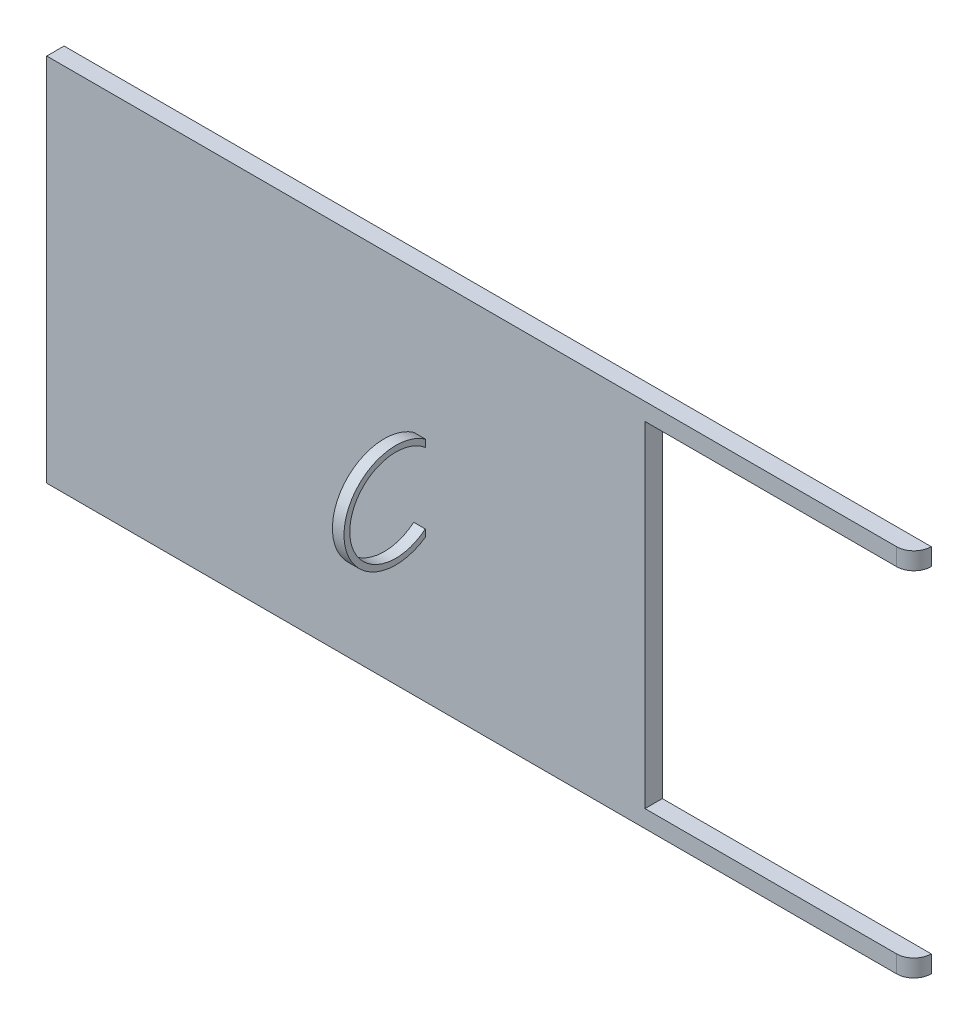
ISO-10303-21;
HEADER;
FILE_DESCRIPTION(('STEP AP214'),'2;1');
FILE_NAME('part.step','',(''),(''),'','','');
FILE_SCHEMA(('AUTOMOTIVE_DESIGN { 1 0 10303 214 1 1 1 1 }'));
ENDSEC;
DATA;
#1=APPLICATION_CONTEXT('core data for automotive mechanical design processes');
#2=APPLICATION_PROTOCOL_DEFINITION('international standard','automotive_design',2000,#1);
#3=PRODUCT_CONTEXT('',#1,'mechanical');
#4=PRODUCT('Part','Part','',(#3));
#5=PRODUCT_RELATED_PRODUCT_CATEGORY('part','',(#4));
#6=PRODUCT_DEFINITION_FORMATION('','',#4);
#7=PRODUCT_DEFINITION_CONTEXT('part definition',#1,'design');
#8=PRODUCT_DEFINITION('design','',#6,#7);
#9=PRODUCT_DEFINITION_SHAPE('','',#8);
#10=(LENGTH_UNIT() NAMED_UNIT(*) SI_UNIT(.MILLI.,.METRE.));
#11=(NAMED_UNIT(*) PLANE_ANGLE_UNIT() SI_UNIT($,.RADIAN.));
#12=(NAMED_UNIT(*) SI_UNIT($,.STERADIAN.) SOLID_ANGLE_UNIT());
#13=UNCERTAINTY_MEASURE_WITH_UNIT(LENGTH_MEASURE(1.E-05),#10,'distance_accuracy_value','');
#14=(GEOMETRIC_REPRESENTATION_CONTEXT(3) GLOBAL_UNCERTAINTY_ASSIGNED_CONTEXT((#13)) GLOBAL_UNIT_ASSIGNED_CONTEXT((#10,
#11,#12)) REPRESENTATION_CONTEXT('',''));
#15=CARTESIAN_POINT('',(0.,0.,0.));
#16=DIRECTION('',(0.,0.,1.));
#17=DIRECTION('',(1.,0.,0.));
#18=AXIS2_PLACEMENT_3D('',#15,#16,#17);
#19=CARTESIAN_POINT('',(0.,0.,3.));
#20=DIRECTION('',(0.,0.,1.));
#21=DIRECTION('',(1.,0.,0.));
#22=AXIS2_PLACEMENT_3D('',#19,#20,#21);
#23=PLANE('',#22);
#24=DIRECTION('',(1.,0.,0.));
#25=VECTOR('',#24,1.);
#26=CARTESIAN_POINT('',(-40.,49.73418814037,3.));
#27=LINE('',#26,#25);
#28=CARTESIAN_POINT('',(-40.,49.73418814037,3.));
#29=VERTEX_POINT('',#28);
#30=CARTESIAN_POINT('',(107.,49.73418814037,3.));
#31=VERTEX_POINT('',#30);
#32=EDGE_CURVE('E208',#29,#31,#27,.T.);
#33=ORIENTED_EDGE('',*,*,#32,.T.);
#34=DIRECTION('',(0.,1.,0.));
#35=VECTOR('',#34,1.);
#36=CARTESIAN_POINT('',(107.,0.,3.));
#37=LINE('',#36,#35);
#38=CARTESIAN_POINT('',(107.,52.73418814037,3.));
#39=VERTEX_POINT('',#38);
#40=EDGE_CURVE('E232',#31,#39,#37,.T.);
#41=ORIENTED_EDGE('',*,*,#40,.T.);
#42=DIRECTION('',(-1.,0.,0.));
#43=VECTOR('',#42,1.);
#44=CARTESIAN_POINT('',(63.479264239857,52.73418814037,3.));
#45=LINE('',#44,#43);
#46=CARTESIAN_POINT('',(63.479264239857,52.73418814037,3.));
#47=VERTEX_POINT('',#46);
#48=EDGE_CURVE('E188',#39,#47,#45,.T.);
#49=ORIENTED_EDGE('',*,*,#48,.T.);
#50=DIRECTION('',(0.,1.,0.));
#51=VECTOR('',#50,1.);
#52=CARTESIAN_POINT('',(63.479264239857,113.73418814037,3.));
#53=LINE('',#52,#51);
#54=CARTESIAN_POINT('',(63.479264239857,110.73418814037,3.));
#55=VERTEX_POINT('',#54);
#56=EDGE_CURVE('E212',#47,#55,#53,.T.);
#57=ORIENTED_EDGE('',*,*,#56,.T.);
#58=DIRECTION('',(1.,0.,0.));
#59=VECTOR('',#58,1.);
#60=CARTESIAN_POINT('',(63.479264239857,110.73418814037,3.));
#61=LINE('',#60,#59);
#62=CARTESIAN_POINT('',(107.,110.73418814037,3.));
#63=VERTEX_POINT('',#62);
#64=EDGE_CURVE('E192',#55,#63,#61,.T.);
#65=ORIENTED_EDGE('',*,*,#64,.T.);
#66=DIRECTION('',(0.,1.,0.));
#67=VECTOR('',#66,1.);
#68=CARTESIAN_POINT('',(107.,0.,3.));
#69=LINE('',#68,#67);
#70=CARTESIAN_POINT('',(107.,113.73418814037,3.));
#71=VERTEX_POINT('',#70);
#72=EDGE_CURVE('E229',#63,#71,#69,.T.);
#73=ORIENTED_EDGE('',*,*,#72,.T.);
#74=DIRECTION('',(-1.,0.,0.));
#75=VECTOR('',#74,1.);
#76=CARTESIAN_POINT('',(-40.,113.73418814037,3.));
#77=LINE('',#76,#75);
#78=CARTESIAN_POINT('',(-40.,113.73418814037,3.));
#79=VERTEX_POINT('',#78);
#80=EDGE_CURVE('E214',#71,#79,#77,.T.);
#81=ORIENTED_EDGE('',*,*,#80,.T.);
#82=DIRECTION('',(0.,-1.,0.));
#83=VECTOR('',#82,1.);
#84=CARTESIAN_POINT('',(-40.,113.73418814037,3.));
#85=LINE('',#84,#83);
#86=EDGE_CURVE('E205',#79,#29,#85,.T.);
#87=ORIENTED_EDGE('',*,*,#86,.T.);
#88=EDGE_LOOP('',(#33,#41,#49,#57,#65,#73,#81,#87));
#89=FACE_BOUND('',#88,.T.);
#90=DIRECTION('',(0.,1.,0.));
#91=VECTOR('',#90,1.);
#92=CARTESIAN_POINT('',(25.479264239857,0.,3.));
#93=LINE('',#92,#91);
#94=CARTESIAN_POINT('',(25.479264239857,74.370638689458,3.));
#95=VERTEX_POINT('',#94);
#96=CARTESIAN_POINT('',(25.479264239857,75.6264134385695,3.));
#97=VERTEX_POINT('',#96);
#98=EDGE_CURVE('E180',#95,#97,#93,.T.);
#99=ORIENTED_EDGE('',*,*,#98,.F.);
#100=DIRECTION('',(-1.,0.,0.));
#101=VECTOR('',#100,1.);
#102=CARTESIAN_POINT('',(25.479264239857,74.370638689458,3.));
#103=LINE('',#102,#101);
#104=CARTESIAN_POINT('',(23.479264239857,74.370638689458,3.));
#105=VERTEX_POINT('',#104);
#106=EDGE_CURVE('E172',#95,#105,#103,.T.);
#107=ORIENTED_EDGE('',*,*,#106,.T.);
#108=DIRECTION('',(0.,1.,0.));
#109=VECTOR('',#108,1.);
#110=CARTESIAN_POINT('',(23.479264239857,0.,3.));
#111=LINE('',#110,#109);
#112=CARTESIAN_POINT('',(23.479264239857,75.6264134385695,3.));
#113=VERTEX_POINT('',#112);
#114=EDGE_CURVE('E177',#105,#113,#111,.T.);
#115=ORIENTED_EDGE('',*,*,#114,.T.);
#116=DIRECTION('',(-1.,0.,0.));
#117=VECTOR('',#116,1.);
#118=CARTESIAN_POINT('',(25.479264239857,75.6264134385695,3.));
#119=LINE('',#118,#117);
#120=EDGE_CURVE('E51',#97,#113,#119,.T.);
#121=ORIENTED_EDGE('',*,*,#120,.F.);
#122=EDGE_LOOP('',(#99,#107,#115,#121));
#123=FACE_BOUND('',#122,.T.);
#124=CARTESIAN_POINT('',(23.479264239857,87.8425850600413,3.));
#125=VERTEX_POINT('',#124);
#126=CARTESIAN_POINT('',(23.479264239857,89.0983598091528,3.));
#127=VERTEX_POINT('',#126);
#128=EDGE_CURVE('E63',#125,#127,#111,.T.);
#129=ORIENTED_EDGE('',*,*,#128,.T.);
#130=DIRECTION('',(-1.,0.,0.));
#131=VECTOR('',#130,1.);
#132=CARTESIAN_POINT('',(25.479264239857,89.0983598091528,3.));
#133=LINE('',#132,#131);
#134=CARTESIAN_POINT('',(25.479264239857,89.0983598091528,3.));
#135=VERTEX_POINT('',#134);
#136=EDGE_CURVE('E58',#127,#135,#133,.F.);
#137=ORIENTED_EDGE('',*,*,#136,.T.);
#138=CARTESIAN_POINT('',(25.479264239857,87.8425850600413,3.));
#139=VERTEX_POINT('',#138);
#140=EDGE_CURVE('E178',#139,#135,#93,.T.);
#141=ORIENTED_EDGE('',*,*,#140,.F.);
#142=DIRECTION('',(-1.,0.,0.));
#143=VECTOR('',#142,1.);
#144=CARTESIAN_POINT('',(25.479264239857,87.8425850600413,3.));
#145=LINE('',#144,#143);
#146=EDGE_CURVE('E12',#125,#139,#145,.F.);
#147=ORIENTED_EDGE('',*,*,#146,.F.);
#148=EDGE_LOOP('',(#129,#137,#141,#147));
#149=FACE_BOUND('',#148,.T.);
#150=ADVANCED_FACE('F43',(#89,#123,#149),#23,.T.);
#151=CARTESIAN_POINT('',(0.,0.,0.));
#152=DIRECTION('',(0.,0.,1.));
#153=DIRECTION('',(1.,0.,0.));
#154=AXIS2_PLACEMENT_3D('',#151,#152,#153);
#155=PLANE('',#154);
#156=DIRECTION('',(0.,-1.,0.));
#157=VECTOR('',#156,1.);
#158=CARTESIAN_POINT('',(-40.,113.73418814037,0.));
#159=LINE('',#158,#157);
#160=CARTESIAN_POINT('',(-40.,113.73418814037,0.));
#161=VERTEX_POINT('',#160);
#162=CARTESIAN_POINT('',(-40.,49.73418814037,0.));
#163=VERTEX_POINT('',#162);
#164=EDGE_CURVE('E204',#161,#163,#159,.T.);
#165=ORIENTED_EDGE('',*,*,#164,.F.);
#166=DIRECTION('',(-1.,0.,0.));
#167=VECTOR('',#166,1.);
#168=CARTESIAN_POINT('',(-40.,113.73418814037,0.));
#169=LINE('',#168,#167);
#170=CARTESIAN_POINT('',(110.,113.73418814037,0.));
#171=VERTEX_POINT('',#170);
#172=EDGE_CURVE('E209',#171,#161,#169,.T.);
#173=ORIENTED_EDGE('',*,*,#172,.F.);
#174=DIRECTION('',(0.,1.,0.));
#175=VECTOR('',#174,1.);
#176=CARTESIAN_POINT('',(110.,113.73418814037,0.));
#177=LINE('',#176,#175);
#178=CARTESIAN_POINT('',(110.,110.73418814037,0.));
#179=VERTEX_POINT('',#178);
#180=EDGE_CURVE('E198',#179,#171,#177,.T.);
#181=ORIENTED_EDGE('',*,*,#180,.F.);
#182=DIRECTION('',(1.,0.,0.));
#183=VECTOR('',#182,1.);
#184=CARTESIAN_POINT('',(63.479264239857,110.73418814037,0.));
#185=LINE('',#184,#183);
#186=CARTESIAN_POINT('',(63.479264239857,110.73418814037,0.));
#187=VERTEX_POINT('',#186);
#188=EDGE_CURVE('E195',#187,#179,#185,.T.);
#189=ORIENTED_EDGE('',*,*,#188,.F.);
#190=DIRECTION('',(0.,1.,0.));
#191=VECTOR('',#190,1.);
#192=CARTESIAN_POINT('',(63.479264239857,113.73418814037,0.));
#193=LINE('',#192,#191);
#194=CARTESIAN_POINT('',(63.479264239857,52.73418814037,0.));
#195=VERTEX_POINT('',#194);
#196=EDGE_CURVE('E221',#195,#187,#193,.T.);
#197=ORIENTED_EDGE('',*,*,#196,.F.);
#198=DIRECTION('',(-1.,0.,0.));
#199=VECTOR('',#198,1.);
#200=CARTESIAN_POINT('',(63.479264239857,52.73418814037,0.));
#201=LINE('',#200,#199);
#202=CARTESIAN_POINT('',(110.,52.73418814037,0.));
#203=VERTEX_POINT('',#202);
#204=EDGE_CURVE('E184',#203,#195,#201,.T.);
#205=ORIENTED_EDGE('',*,*,#204,.F.);
#206=DIRECTION('',(0.,1.,0.));
#207=VECTOR('',#206,1.);
#208=CARTESIAN_POINT('',(110.,49.73418814037,0.));
#209=LINE('',#208,#207);
#210=CARTESIAN_POINT('',(110.,49.73418814037,0.));
#211=VERTEX_POINT('',#210);
#212=EDGE_CURVE('E185',#211,#203,#209,.T.);
#213=ORIENTED_EDGE('',*,*,#212,.F.);
#214=DIRECTION('',(1.,0.,0.));
#215=VECTOR('',#214,1.);
#216=CARTESIAN_POINT('',(-40.,49.73418814037,0.));
#217=LINE('',#216,#215);
#218=EDGE_CURVE('E219',#163,#211,#217,.T.);
#219=ORIENTED_EDGE('',*,*,#218,.F.);
#220=EDGE_LOOP('',(#165,#173,#181,#189,#197,#205,#213,#219));
#221=FACE_BOUND('',#220,.T.);
#222=DIRECTION('',(-1.,0.,0.));
#223=VECTOR('',#222,1.);
#224=CARTESIAN_POINT('',(25.479264239857,85.5570436361809,0.));
#225=LINE('',#224,#223);
#226=CARTESIAN_POINT('',(23.479264239857,85.5570436361809,0.));
#227=VERTEX_POINT('',#226);
#228=CARTESIAN_POINT('',(25.479264239857,85.5570436361809,0.));
#229=VERTEX_POINT('',#228);
#230=EDGE_CURVE('E147',#227,#229,#225,.F.);
#231=ORIENTED_EDGE('',*,*,#230,.F.);
#232=DIRECTION('',(0.,1.,0.));
#233=VECTOR('',#232,1.);
#234=CARTESIAN_POINT('',(23.479264239857,0.,0.));
#235=LINE('',#234,#233);
#236=CARTESIAN_POINT('',(23.479264239857,77.9119548624299,0.));
#237=VERTEX_POINT('',#236);
#238=EDGE_CURVE('E141',#237,#227,#235,.T.);
#239=ORIENTED_EDGE('',*,*,#238,.F.);
#240=DIRECTION('',(-1.,0.,0.));
#241=VECTOR('',#240,1.);
#242=CARTESIAN_POINT('',(25.479264239857,77.9119548624299,0.));
#243=LINE('',#242,#241);
#244=CARTESIAN_POINT('',(25.479264239857,77.9119548624299,0.));
#245=VERTEX_POINT('',#244);
#246=EDGE_CURVE('E144',#245,#237,#243,.T.);
#247=ORIENTED_EDGE('',*,*,#246,.F.);
#248=DIRECTION('',(0.,1.,0.));
#249=VECTOR('',#248,1.);
#250=CARTESIAN_POINT('',(25.479264239857,0.,0.));
#251=LINE('',#250,#249);
#252=EDGE_CURVE('E151',#245,#229,#251,.T.);
#253=ORIENTED_EDGE('',*,*,#252,.T.);
#254=EDGE_LOOP('',(#231,#239,#247,#253));
#255=FACE_BOUND('',#254,.T.);
#256=ADVANCED_FACE('F143',(#221,#255),#155,.F.);
#257=CARTESIAN_POINT('',(-40.,113.73418814037,3.));
#258=DIRECTION('',(1.,0.,0.));
#259=DIRECTION('',(0.,0.,-1.));
#260=AXIS2_PLACEMENT_3D('',#257,#258,#259);
#261=PLANE('',#260);
#262=ORIENTED_EDGE('',*,*,#164,.T.);
#263=DIRECTION('',(0.,0.,-1.));
#264=VECTOR('',#263,1.);
#265=CARTESIAN_POINT('',(-40.,49.73418814037,3.));
#266=LINE('',#265,#264);
#267=EDGE_CURVE('E226',#29,#163,#266,.T.);
#268=ORIENTED_EDGE('',*,*,#267,.F.);
#269=ORIENTED_EDGE('',*,*,#86,.F.);
#270=DIRECTION('',(0.,0.,-1.));
#271=VECTOR('',#270,1.);
#272=CARTESIAN_POINT('',(-40.,113.73418814037,3.));
#273=LINE('',#272,#271);
#274=EDGE_CURVE('E216',#79,#161,#273,.T.);
#275=ORIENTED_EDGE('',*,*,#274,.T.);
#276=EDGE_LOOP('',(#262,#268,#269,#275));
#277=FACE_BOUND('',#276,.T.);
#278=ADVANCED_FACE('F279',(#277),#261,.F.);
#279=CARTESIAN_POINT('',(-40.,49.73418814037,3.));
#280=DIRECTION('',(0.,1.,0.));
#281=DIRECTION('',(0.,0.,1.));
#282=AXIS2_PLACEMENT_3D('',#279,#280,#281);
#283=PLANE('',#282);
#284=ORIENTED_EDGE('',*,*,#218,.T.);
#285=CARTESIAN_POINT('',(107.,49.73418814037,0.));
#286=DIRECTION('',(0.,1.,0.));
#287=DIRECTION('',(0.,0.,1.));
#288=AXIS2_PLACEMENT_3D('',#285,#286,#287);
#289=CIRCLE('',#288,3.);
#290=EDGE_CURVE('E237',#211,#31,#289,.F.);
#291=ORIENTED_EDGE('',*,*,#290,.T.);
#292=ORIENTED_EDGE('',*,*,#32,.F.);
#293=ORIENTED_EDGE('',*,*,#267,.T.);
#294=EDGE_LOOP('',(#284,#291,#292,#293));
#295=FACE_BOUND('',#294,.T.);
#296=ADVANCED_FACE('F293',(#295),#283,.F.);
#297=CARTESIAN_POINT('',(63.479264239857,113.73418814037,3.));
#298=DIRECTION('',(-1.,0.,0.));
#299=DIRECTION('',(0.,0.,1.));
#300=AXIS2_PLACEMENT_3D('',#297,#298,#299);
#301=PLANE('',#300);
#302=ORIENTED_EDGE('',*,*,#56,.F.);
#303=DIRECTION('',(0.,0.,1.));
#304=VECTOR('',#303,1.);
#305=CARTESIAN_POINT('',(63.479264239857,52.73418814037,-46.6173664599905));
#306=LINE('',#305,#304);
#307=EDGE_CURVE('E181',#195,#47,#306,.T.);
#308=ORIENTED_EDGE('',*,*,#307,.F.);
#309=ORIENTED_EDGE('',*,*,#196,.T.);
#310=DIRECTION('',(0.,0.,1.));
#311=VECTOR('',#310,1.);
#312=CARTESIAN_POINT('',(63.479264239857,110.73418814037,-46.6173664599905));
#313=LINE('',#312,#311);
#314=EDGE_CURVE('E201',#187,#55,#313,.T.);
#315=ORIENTED_EDGE('',*,*,#314,.T.);
#316=EDGE_LOOP('',(#302,#308,#309,#315));
#317=FACE_BOUND('',#316,.T.);
#318=ADVANCED_FACE('F289',(#317),#301,.F.);
#319=CARTESIAN_POINT('',(-40.,113.73418814037,3.));
#320=DIRECTION('',(0.,-1.,0.));
#321=DIRECTION('',(0.,0.,-1.));
#322=AXIS2_PLACEMENT_3D('',#319,#320,#321);
#323=PLANE('',#322);
#324=ORIENTED_EDGE('',*,*,#80,.F.);
#325=CARTESIAN_POINT('',(107.,113.73418814037,0.));
#326=DIRECTION('',(0.,-1.,0.));
#327=DIRECTION('',(0.,0.,-1.));
#328=AXIS2_PLACEMENT_3D('',#325,#326,#327);
#329=CIRCLE('',#328,3.);
#330=EDGE_CURVE('E239',#71,#171,#329,.F.);
#331=ORIENTED_EDGE('',*,*,#330,.T.);
#332=ORIENTED_EDGE('',*,*,#172,.T.);
#333=ORIENTED_EDGE('',*,*,#274,.F.);
#334=EDGE_LOOP('',(#324,#331,#332,#333));
#335=FACE_BOUND('',#334,.T.);
#336=ADVANCED_FACE('F286',(#335),#323,.F.);
#337=CARTESIAN_POINT('',(63.479264239857,110.73418814037,-46.6173664599905));
#338=DIRECTION('',(0.,-1.,0.));
#339=DIRECTION('',(0.,0.,-1.));
#340=AXIS2_PLACEMENT_3D('',#337,#338,#339);
#341=PLANE('',#340);
#342=ORIENTED_EDGE('',*,*,#188,.T.);
#343=CARTESIAN_POINT('',(107.,110.73418814037,0.));
#344=DIRECTION('',(0.,-1.,0.));
#345=DIRECTION('',(0.,0.,-1.));
#346=AXIS2_PLACEMENT_3D('',#343,#344,#345);
#347=CIRCLE('',#346,3.);
#348=EDGE_CURVE('E159',#179,#63,#347,.T.);
#349=ORIENTED_EDGE('',*,*,#348,.T.);
#350=ORIENTED_EDGE('',*,*,#64,.F.);
#351=ORIENTED_EDGE('',*,*,#314,.F.);
#352=EDGE_LOOP('',(#342,#349,#350,#351));
#353=FACE_BOUND('',#352,.T.);
#354=ADVANCED_FACE('F283',(#353),#341,.T.);
#355=CARTESIAN_POINT('',(63.479264239857,52.73418814037,-46.6173664599905));
#356=DIRECTION('',(0.,1.,0.));
#357=DIRECTION('',(0.,0.,1.));
#358=AXIS2_PLACEMENT_3D('',#355,#356,#357);
#359=PLANE('',#358);
#360=ORIENTED_EDGE('',*,*,#48,.F.);
#361=CARTESIAN_POINT('',(107.,52.73418814037,0.));
#362=DIRECTION('',(0.,1.,0.));
#363=DIRECTION('',(0.,0.,1.));
#364=AXIS2_PLACEMENT_3D('',#361,#362,#363);
#365=CIRCLE('',#364,3.);
#366=EDGE_CURVE('E235',#39,#203,#365,.T.);
#367=ORIENTED_EDGE('',*,*,#366,.T.);
#368=ORIENTED_EDGE('',*,*,#204,.T.);
#369=ORIENTED_EDGE('',*,*,#307,.T.);
#370=EDGE_LOOP('',(#360,#367,#368,#369));
#371=FACE_BOUND('',#370,.T.);
#372=ADVANCED_FACE('F302',(#371),#359,.T.);
#373=CARTESIAN_POINT('',(107.,0.,0.));
#374=DIRECTION('',(0.,1.,0.));
#375=DIRECTION('',(0.,0.,1.));
#376=AXIS2_PLACEMENT_3D('',#373,#374,#375);
#377=CYLINDRICAL_SURFACE('',#376,3.);
#378=ORIENTED_EDGE('',*,*,#290,.F.);
#379=ORIENTED_EDGE('',*,*,#212,.T.);
#380=ORIENTED_EDGE('',*,*,#366,.F.);
#381=ORIENTED_EDGE('',*,*,#40,.F.);
#382=EDGE_LOOP('',(#378,#379,#380,#381));
#383=FACE_BOUND('',#382,.T.);
#384=ADVANCED_FACE('F300',(#383),#377,.T.);
#385=CARTESIAN_POINT('',(107.,0.,0.));
#386=DIRECTION('',(0.,1.,0.));
#387=DIRECTION('',(0.,0.,1.));
#388=AXIS2_PLACEMENT_3D('',#385,#386,#387);
#389=CYLINDRICAL_SURFACE('',#388,3.);
#390=ORIENTED_EDGE('',*,*,#348,.F.);
#391=ORIENTED_EDGE('',*,*,#180,.T.);
#392=ORIENTED_EDGE('',*,*,#330,.F.);
#393=ORIENTED_EDGE('',*,*,#72,.F.);
#394=EDGE_LOOP('',(#390,#391,#392,#393));
#395=FACE_BOUND('',#394,.T.);
#396=ADVANCED_FACE('F45',(#395),#389,.T.);
#397=CARTESIAN_POINT('',(25.479264239857,81.7344992493054,8.10243279254039));
#398=DIRECTION('',(-1.,0.,0.));
#399=DIRECTION('',(0.,0.,1.));
#400=AXIS2_PLACEMENT_3D('',#397,#398,#399);
#401=CYLINDRICAL_SURFACE('',#400,8.95886503678159);
#402=CARTESIAN_POINT('',(23.479264239857,81.7344992493054,8.10243279254039));
#403=DIRECTION('',(1.,0.,0.));
#404=DIRECTION('',(0.,0.,-1.));
#405=AXIS2_PLACEMENT_3D('',#402,#403,#404);
#406=CIRCLE('',#405,8.95886503678159);
#407=EDGE_CURVE('E156',#237,#227,#406,.T.);
#408=ORIENTED_EDGE('',*,*,#407,.T.);
#409=ORIENTED_EDGE('',*,*,#230,.T.);
#410=CARTESIAN_POINT('',(25.479264239857,81.7344992493054,8.10243279254039));
#411=DIRECTION('',(1.,0.,0.));
#412=DIRECTION('',(0.,0.,-1.));
#413=AXIS2_PLACEMENT_3D('',#410,#411,#412);
#414=CIRCLE('',#413,8.95886503678159);
#415=EDGE_CURVE('E158',#245,#229,#414,.T.);
#416=ORIENTED_EDGE('',*,*,#415,.F.);
#417=ORIENTED_EDGE('',*,*,#246,.T.);
#418=EDGE_LOOP('',(#408,#409,#416,#417));
#419=FACE_BOUND('',#418,.T.);
#420=ADVANCED_FACE('F155',(#419),#401,.T.);
#421=CARTESIAN_POINT('',(23.479264239857,81.7344992493054,8.10243279254039));
#422=DIRECTION('',(1.,0.,0.));
#423=DIRECTION('',(0.,0.,-1.));
#424=AXIS2_PLACEMENT_3D('',#421,#422,#423);
#425=PLANE('',#424);
#426=ORIENTED_EDGE('',*,*,#407,.F.);
#427=ORIENTED_EDGE('',*,*,#238,.T.);
#428=EDGE_LOOP('',(#426,#427));
#429=FACE_BOUND('',#428,.T.);
#430=ADVANCED_FACE('F161',(#429),#425,.F.);
#431=CARTESIAN_POINT('',(25.479264239857,81.7344992493054,8.10243279254039));
#432=DIRECTION('',(1.,0.,0.));
#433=DIRECTION('',(0.,0.,-1.));
#434=AXIS2_PLACEMENT_3D('',#431,#432,#433);
#435=PLANE('',#434);
#436=ORIENTED_EDGE('',*,*,#252,.F.);
#437=ORIENTED_EDGE('',*,*,#415,.T.);
#438=EDGE_LOOP('',(#436,#437));
#439=FACE_BOUND('',#438,.T.);
#440=ADVANCED_FACE('F262',(#439),#435,.T.);
#441=EDGE_CURVE('E174',#135,#95,#414,.T.);
#442=ORIENTED_EDGE('',*,*,#441,.T.);
#443=ORIENTED_EDGE('',*,*,#98,.T.);
#444=CARTESIAN_POINT('',(25.479264239857,81.7344992493054,8.10243279254039));
#445=DIRECTION('',(1.,0.,0.));
#446=DIRECTION('',(0.,0.,-1.));
#447=AXIS2_PLACEMENT_3D('',#444,#445,#446);
#448=CIRCLE('',#447,7.95886503678158);
#449=EDGE_CURVE('E163',#139,#97,#448,.T.);
#450=ORIENTED_EDGE('',*,*,#449,.F.);
#451=ORIENTED_EDGE('',*,*,#140,.T.);
#452=EDGE_LOOP('',(#442,#443,#450,#451));
#453=FACE_BOUND('',#452,.T.);
#454=ADVANCED_FACE('F264',(#453),#435,.T.);
#455=ORIENTED_EDGE('',*,*,#114,.F.);
#456=EDGE_CURVE('E162',#127,#105,#406,.T.);
#457=ORIENTED_EDGE('',*,*,#456,.F.);
#458=ORIENTED_EDGE('',*,*,#128,.F.);
#459=CARTESIAN_POINT('',(23.479264239857,81.7344992493054,8.10243279254039));
#460=DIRECTION('',(1.,0.,0.));
#461=DIRECTION('',(0.,0.,-1.));
#462=AXIS2_PLACEMENT_3D('',#459,#460,#461);
#463=CIRCLE('',#462,7.95886503678158);
#464=EDGE_CURVE('E167',#125,#113,#463,.T.);
#465=ORIENTED_EDGE('',*,*,#464,.T.);
#466=EDGE_LOOP('',(#455,#457,#458,#465));
#467=FACE_BOUND('',#466,.T.);
#468=ADVANCED_FACE('F253',(#467),#425,.F.);
#469=ORIENTED_EDGE('',*,*,#136,.F.);
#470=ORIENTED_EDGE('',*,*,#456,.T.);
#471=ORIENTED_EDGE('',*,*,#106,.F.);
#472=ORIENTED_EDGE('',*,*,#441,.F.);
#473=EDGE_LOOP('',(#469,#470,#471,#472));
#474=FACE_BOUND('',#473,.T.);
#475=ADVANCED_FACE('F257',(#474),#401,.T.);
#476=CARTESIAN_POINT('',(25.479264239857,81.7344992493054,8.10243279254039));
#477=DIRECTION('',(-1.,0.,0.));
#478=DIRECTION('',(0.,0.,1.));
#479=AXIS2_PLACEMENT_3D('',#476,#477,#478);
#480=CYLINDRICAL_SURFACE('',#479,7.95886503678158);
#481=ORIENTED_EDGE('',*,*,#464,.F.);
#482=ORIENTED_EDGE('',*,*,#146,.T.);
#483=ORIENTED_EDGE('',*,*,#449,.T.);
#484=ORIENTED_EDGE('',*,*,#120,.T.);
#485=EDGE_LOOP('',(#481,#482,#483,#484));
#486=FACE_BOUND('',#485,.T.);
#487=ADVANCED_FACE('F247',(#486),#480,.F.);
#488=CLOSED_SHELL('',(#150,#256,#278,#296,#318,#336,#354,#372,#384,#396,#420,#430,#440,#454,
#468,#475,#487));
#489=MANIFOLD_SOLID_BREP('B2',#488);
#490=ADVANCED_BREP_SHAPE_REPRESENTATION('',(#18,#489),#14);
#491=SHAPE_DEFINITION_REPRESENTATION(#9,#490);
ENDSEC;
END-ISO-10303-21;
